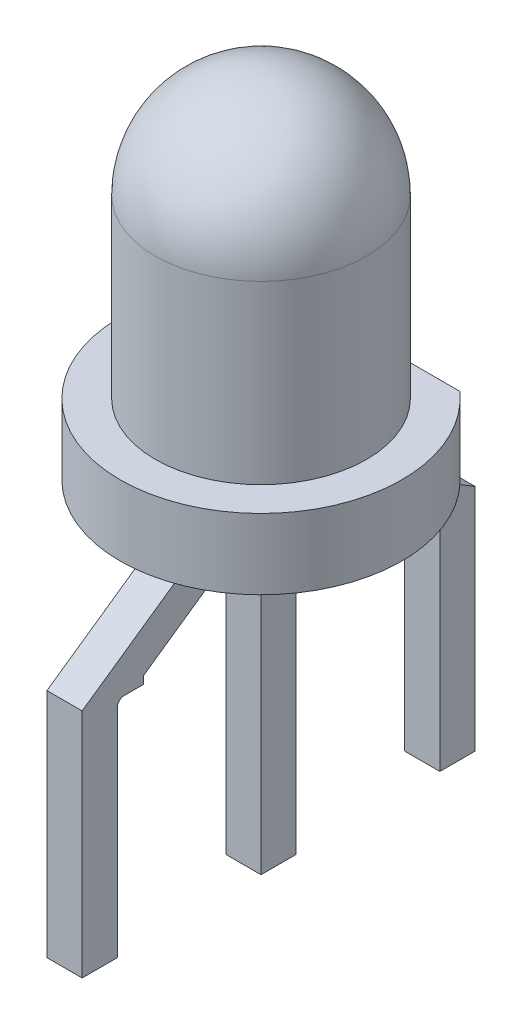
ISO-10303-21;
HEADER;
FILE_DESCRIPTION(('STEP AP214'),'2;1');
FILE_NAME('part.step','',(''),(''),'','','');
FILE_SCHEMA(('AUTOMOTIVE_DESIGN { 1 0 10303 214 1 1 1 1 }'));
ENDSEC;
DATA;
#1=APPLICATION_CONTEXT('core data for automotive mechanical design processes');
#2=APPLICATION_PROTOCOL_DEFINITION('international standard','automotive_design',2000,#1);
#3=PRODUCT_CONTEXT('',#1,'mechanical');
#4=PRODUCT('Part','Part','',(#3));
#5=PRODUCT_RELATED_PRODUCT_CATEGORY('part','',(#4));
#6=PRODUCT_DEFINITION_FORMATION('','',#4);
#7=PRODUCT_DEFINITION_CONTEXT('part definition',#1,'design');
#8=PRODUCT_DEFINITION('design','',#6,#7);
#9=PRODUCT_DEFINITION_SHAPE('','',#8);
#10=(LENGTH_UNIT() NAMED_UNIT(*) SI_UNIT(.MILLI.,.METRE.));
#11=(NAMED_UNIT(*) PLANE_ANGLE_UNIT() SI_UNIT($,.RADIAN.));
#12=(NAMED_UNIT(*) SI_UNIT($,.STERADIAN.) SOLID_ANGLE_UNIT());
#13=UNCERTAINTY_MEASURE_WITH_UNIT(LENGTH_MEASURE(1.E-05),#10,'distance_accuracy_value','');
#14=(GEOMETRIC_REPRESENTATION_CONTEXT(3) GLOBAL_UNCERTAINTY_ASSIGNED_CONTEXT((#13)) GLOBAL_UNIT_ASSIGNED_CONTEXT((#10,
#11,#12)) REPRESENTATION_CONTEXT('',''));
#15=CARTESIAN_POINT('',(0.,0.,0.));
#16=DIRECTION('',(0.,0.,1.));
#17=DIRECTION('',(1.,0.,0.));
#18=AXIS2_PLACEMENT_3D('',#15,#16,#17);
#19=CARTESIAN_POINT('',(-0.25,-33.1036291829165,-0.745030280763507));
#20=DIRECTION('',(-1.,0.,0.));
#21=DIRECTION('',(0.,0.,1.));
#22=AXIS2_PLACEMENT_3D('',#19,#20,#21);
#23=PLANE('',#22);
#24=DIRECTION('',(0.,0.,1.));
#25=VECTOR('',#24,1.);
#26=CARTESIAN_POINT('',(-0.25,0.,-0.745030280763507));
#27=LINE('',#26,#25);
#28=CARTESIAN_POINT('',(-0.25,0.,0.250000000000001));
#29=VERTEX_POINT('',#28);
#30=CARTESIAN_POINT('',(-0.25,0.,-0.250000000000001));
#31=VERTEX_POINT('',#30);
#32=EDGE_CURVE('E261',#29,#31,#27,.F.);
#33=ORIENTED_EDGE('',*,*,#32,.T.);
#34=DIRECTION('',(0.,-1.,0.));
#35=VECTOR('',#34,1.);
#36=CARTESIAN_POINT('',(-0.25,-33.1036291829165,-0.249999999999997));
#37=LINE('',#36,#35);
#38=CARTESIAN_POINT('',(-0.25,-4.60707603112542,-0.25));
#39=VERTEX_POINT('',#38);
#40=EDGE_CURVE('E402',#31,#39,#37,.T.);
#41=ORIENTED_EDGE('',*,*,#40,.T.);
#42=DIRECTION('',(0.,0.,1.));
#43=VECTOR('',#42,1.);
#44=CARTESIAN_POINT('',(-0.25,-4.60707603112542,3.26296421802397));
#45=LINE('',#44,#43);
#46=CARTESIAN_POINT('',(-0.25,-4.60707603112542,0.250000000000001));
#47=VERTEX_POINT('',#46);
#48=EDGE_CURVE('E397',#39,#47,#45,.T.);
#49=ORIENTED_EDGE('',*,*,#48,.T.);
#50=DIRECTION('',(0.,-1.,0.));
#51=VECTOR('',#50,1.);
#52=CARTESIAN_POINT('',(-0.25,-33.1036291829165,0.249999999999997));
#53=LINE('',#52,#51);
#54=EDGE_CURVE('E288',#29,#47,#53,.T.);
#55=ORIENTED_EDGE('',*,*,#54,.F.);
#56=EDGE_LOOP('',(#33,#41,#49,#55));
#57=FACE_BOUND('',#56,.T.);
#58=ADVANCED_FACE('F17',(#57),#23,.T.);
#59=CARTESIAN_POINT('',(-0.25,-33.1036291829165,-0.745030280763507));
#60=DIRECTION('',(-1.,0.,0.));
#61=DIRECTION('',(0.,0.,1.));
#62=AXIS2_PLACEMENT_3D('',#59,#60,#61);
#63=PLANE('',#62);
#64=CARTESIAN_POINT('',(-0.25,-1.53,2.1920011));
#65=DIRECTION('',(-1.,0.,0.));
#66=DIRECTION('',(0.,0.,1.));
#67=AXIS2_PLACEMENT_3D('',#64,#65,#66);
#68=CIRCLE('',#67,0.0979988999999992);
#69=CARTESIAN_POINT('',(-0.25,-1.4320011,2.1920011));
#70=VERTEX_POINT('',#69);
#71=CARTESIAN_POINT('',(-0.25,-1.53,2.29));
#72=VERTEX_POINT('',#71);
#73=EDGE_CURVE('E20',#70,#72,#68,.F.);
#74=ORIENTED_EDGE('',*,*,#73,.T.);
#75=DIRECTION('',(0.,1.,0.));
#76=VECTOR('',#75,1.);
#77=CARTESIAN_POINT('',(-0.25,-33.1036291829165,2.29));
#78=LINE('',#77,#76);
#79=CARTESIAN_POINT('',(-0.25,-4.60707603112542,2.29));
#80=VERTEX_POINT('',#79);
#81=EDGE_CURVE('E204',#80,#72,#78,.T.);
#82=ORIENTED_EDGE('',*,*,#81,.F.);
#83=DIRECTION('',(0.,0.,1.));
#84=VECTOR('',#83,1.);
#85=CARTESIAN_POINT('',(-0.25,-4.60707603112542,3.26296421802397));
#86=LINE('',#85,#84);
#87=CARTESIAN_POINT('',(-0.25,-4.60707603112542,2.79));
#88=VERTEX_POINT('',#87);
#89=EDGE_CURVE('E216',#80,#88,#86,.T.);
#90=ORIENTED_EDGE('',*,*,#89,.T.);
#91=DIRECTION('',(0.,-1.,0.));
#92=VECTOR('',#91,1.);
#93=CARTESIAN_POINT('',(-0.25,-33.1036291829165,2.78999999999999));
#94=LINE('',#93,#92);
#95=CARTESIAN_POINT('',(-0.25,-1.32219444197155,2.79));
#96=VERTEX_POINT('',#95);
#97=EDGE_CURVE('E238',#96,#88,#94,.T.);
#98=ORIENTED_EDGE('',*,*,#97,.F.);
#99=DIRECTION('',(0.,-0.572056991997396,0.820213873271412));
#100=VECTOR('',#99,1.);
#101=CARTESIAN_POINT('',(-0.25,-10.0639752924873,15.323943350043));
#102=LINE('',#101,#100);
#103=CARTESIAN_POINT('',(-0.25,-0.282996074506152,1.3));
#104=VERTEX_POINT('',#103);
#105=EDGE_CURVE('E286',#104,#96,#102,.T.);
#106=ORIENTED_EDGE('',*,*,#105,.F.);
#107=DIRECTION('',(0.,1.,0.));
#108=VECTOR('',#107,1.);
#109=CARTESIAN_POINT('',(-0.25,-33.1036291829165,1.3));
#110=LINE('',#109,#108);
#111=CARTESIAN_POINT('',(-0.25,0.,1.3));
#112=VERTEX_POINT('',#111);
#113=EDGE_CURVE('E264',#104,#112,#110,.T.);
#114=ORIENTED_EDGE('',*,*,#113,.T.);
#115=DIRECTION('',(0.,0.,1.));
#116=VECTOR('',#115,1.);
#117=CARTESIAN_POINT('',(-0.25,0.,-0.745030280763507));
#118=LINE('',#117,#116);
#119=CARTESIAN_POINT('',(-0.25,0.,0.799999999999999));
#120=VERTEX_POINT('',#119);
#121=EDGE_CURVE('E258',#112,#120,#118,.F.);
#122=ORIENTED_EDGE('',*,*,#121,.T.);
#123=DIRECTION('',(0.,1.,0.));
#124=VECTOR('',#123,1.);
#125=CARTESIAN_POINT('',(-0.25,-33.1036291829165,0.799999999999999));
#126=LINE('',#125,#124);
#127=CARTESIAN_POINT('',(-0.25,-0.543868891918857,0.799999999999998));
#128=VERTEX_POINT('',#127);
#129=EDGE_CURVE('E255',#120,#128,#126,.F.);
#130=ORIENTED_EDGE('',*,*,#129,.T.);
#131=DIRECTION('',(0.,0.572056991997396,-0.820213873271412));
#132=VECTOR('',#131,1.);
#133=CARTESIAN_POINT('',(-0.25,-10.474082229123,15.0379148540443));
#134=LINE('',#133,#132);
#135=CARTESIAN_POINT('',(-0.25,-1.32219444197155,1.91596121191667));
#136=VERTEX_POINT('',#135);
#137=EDGE_CURVE('E252',#136,#128,#134,.T.);
#138=ORIENTED_EDGE('',*,*,#137,.F.);
#139=DIRECTION('',(0.,1.,0.));
#140=VECTOR('',#139,1.);
#141=CARTESIAN_POINT('',(-0.25,-33.1036291829165,1.91596121191667));
#142=LINE('',#141,#140);
#143=CARTESIAN_POINT('',(-0.25,-1.4320011,1.91596121191667));
#144=VERTEX_POINT('',#143);
#145=EDGE_CURVE('E249',#144,#136,#142,.T.);
#146=ORIENTED_EDGE('',*,*,#145,.F.);
#147=DIRECTION('',(0.,0.,-1.));
#148=VECTOR('',#147,1.);
#149=CARTESIAN_POINT('',(-0.25,-1.4320011,-0.745030280763507));
#150=LINE('',#149,#148);
#151=EDGE_CURVE('E198',#70,#144,#150,.T.);
#152=ORIENTED_EDGE('',*,*,#151,.F.);
#153=EDGE_LOOP('',(#74,#82,#90,#98,#106,#114,#122,#130,#138,#146,#152));
#154=FACE_BOUND('',#153,.T.);
#155=ADVANCED_FACE('F202',(#154),#63,.T.);
#156=CARTESIAN_POINT('',(-0.25,-33.1036291829165,-0.745030280763507));
#157=DIRECTION('',(-1.,0.,0.));
#158=DIRECTION('',(0.,0.,1.));
#159=AXIS2_PLACEMENT_3D('',#156,#157,#158);
#160=PLANE('',#159);
#161=DIRECTION('',(0.,-0.518539477269152,-0.855053688673077));
#162=VECTOR('',#161,1.);
#163=CARTESIAN_POINT('',(-0.25,-8.98245643141332,-15.3730945478082));
#164=LINE('',#163,#162);
#165=CARTESIAN_POINT('',(-0.25,-0.447957151368763,-1.3));
#166=VERTEX_POINT('',#165);
#167=CARTESIAN_POINT('',(-0.25,-1.3515540030823,-2.79));
#168=VERTEX_POINT('',#167);
#169=EDGE_CURVE('E333',#166,#168,#164,.T.);
#170=ORIENTED_EDGE('',*,*,#169,.T.);
#171=DIRECTION('',(0.,-1.,0.));
#172=VECTOR('',#171,1.);
#173=CARTESIAN_POINT('',(-0.25,-33.1036291829165,-2.79));
#174=LINE('',#173,#172);
#175=CARTESIAN_POINT('',(-0.25,-4.60707603112542,-2.79));
#176=VERTEX_POINT('',#175);
#177=EDGE_CURVE('E422',#168,#176,#174,.T.);
#178=ORIENTED_EDGE('',*,*,#177,.T.);
#179=DIRECTION('',(0.,0.,1.));
#180=VECTOR('',#179,1.);
#181=CARTESIAN_POINT('',(-0.25,-4.60707603112542,3.26296421802397));
#182=LINE('',#181,#180);
#183=CARTESIAN_POINT('',(-0.25,-4.60707603112542,-2.29));
#184=VERTEX_POINT('',#183);
#185=EDGE_CURVE('E416',#176,#184,#182,.T.);
#186=ORIENTED_EDGE('',*,*,#185,.T.);
#187=DIRECTION('',(0.,1.,0.));
#188=VECTOR('',#187,1.);
#189=CARTESIAN_POINT('',(-0.25,-33.1036291829165,-2.29));
#190=LINE('',#189,#188);
#191=CARTESIAN_POINT('',(-0.25,-1.63,-2.29));
#192=VERTEX_POINT('',#191);
#193=EDGE_CURVE('E410',#184,#192,#190,.T.);
#194=ORIENTED_EDGE('',*,*,#193,.T.);
#195=CARTESIAN_POINT('',(-0.25,-1.63,-2.19));
#196=DIRECTION('',(-1.,0.,0.));
#197=DIRECTION('',(0.,0.,1.));
#198=AXIS2_PLACEMENT_3D('',#195,#196,#197);
#199=CIRCLE('',#198,0.0999999999999998);
#200=CARTESIAN_POINT('',(-0.25,-1.53,-2.19));
#201=VERTEX_POINT('',#200);
#202=EDGE_CURVE('E241',#192,#201,#199,.F.);
#203=ORIENTED_EDGE('',*,*,#202,.T.);
#204=DIRECTION('',(0.,0.,1.));
#205=VECTOR('',#204,1.);
#206=CARTESIAN_POINT('',(-0.25,-1.53,-0.745030280763514));
#207=LINE('',#206,#205);
#208=CARTESIAN_POINT('',(-0.25,-1.53,-1.2));
#209=VERTEX_POINT('',#208);
#210=EDGE_CURVE('E225',#201,#209,#207,.T.);
#211=ORIENTED_EDGE('',*,*,#210,.T.);
#212=CARTESIAN_POINT('',(-0.25,-1.13,-1.2));
#213=DIRECTION('',(-1.,0.,0.));
#214=DIRECTION('',(0.,0.,1.));
#215=AXIS2_PLACEMENT_3D('',#212,#213,#214);
#216=CIRCLE('',#215,0.4);
#217=CARTESIAN_POINT('',(-0.25,-1.13,-0.800000000000001));
#218=VERTEX_POINT('',#217);
#219=EDGE_CURVE('E319',#218,#209,#216,.F.);
#220=ORIENTED_EDGE('',*,*,#219,.F.);
#221=DIRECTION('',(0.,1.,0.));
#222=VECTOR('',#221,1.);
#223=CARTESIAN_POINT('',(-0.25,-33.1036291829165,-0.800000000000001));
#224=LINE('',#223,#222);
#225=CARTESIAN_POINT('',(-0.25,0.,-0.800000000000001));
#226=VERTEX_POINT('',#225);
#227=EDGE_CURVE('E257',#218,#226,#224,.T.);
#228=ORIENTED_EDGE('',*,*,#227,.T.);
#229=DIRECTION('',(0.,0.,1.));
#230=VECTOR('',#229,1.);
#231=CARTESIAN_POINT('',(-0.25,0.,-0.745030280763507));
#232=LINE('',#231,#230);
#233=CARTESIAN_POINT('',(-0.25,0.,-1.3));
#234=VERTEX_POINT('',#233);
#235=EDGE_CURVE('E265',#226,#234,#232,.F.);
#236=ORIENTED_EDGE('',*,*,#235,.T.);
#237=DIRECTION('',(0.,1.,0.));
#238=VECTOR('',#237,1.);
#239=CARTESIAN_POINT('',(-0.25,-33.1036291829165,-1.3));
#240=LINE('',#239,#238);
#241=EDGE_CURVE('E268',#234,#166,#240,.F.);
#242=ORIENTED_EDGE('',*,*,#241,.T.);
#243=EDGE_LOOP('',(#170,#178,#186,#194,#203,#211,#220,#228,#236,#242));
#244=FACE_BOUND('',#243,.T.);
#245=ADVANCED_FACE('F428',(#244),#160,.T.);
#246=CARTESIAN_POINT('',(0.25,-33.1036291829165,-0.249999999999997));
#247=DIRECTION('',(0.,0.,1.));
#248=DIRECTION('',(0.,-1.,0.));
#249=AXIS2_PLACEMENT_3D('',#246,#247,#248);
#250=PLANE('',#249);
#251=DIRECTION('',(1.,0.,0.));
#252=VECTOR('',#251,1.);
#253=CARTESIAN_POINT('',(-2.,-4.60707603112542,-0.249999999999999));
#254=LINE('',#253,#252);
#255=CARTESIAN_POINT('',(0.25,-4.60707603112542,-0.25));
#256=VERTEX_POINT('',#255);
#257=EDGE_CURVE('E399',#256,#39,#254,.F.);
#258=ORIENTED_EDGE('',*,*,#257,.T.);
#259=ORIENTED_EDGE('',*,*,#40,.F.);
#260=DIRECTION('',(1.,0.,0.));
#261=VECTOR('',#260,1.);
#262=CARTESIAN_POINT('',(0.25,0.,-0.250000000000001));
#263=LINE('',#262,#261);
#264=CARTESIAN_POINT('',(0.25,0.,-0.250000000000001));
#265=VERTEX_POINT('',#264);
#266=EDGE_CURVE('E404',#265,#31,#263,.F.);
#267=ORIENTED_EDGE('',*,*,#266,.F.);
#268=DIRECTION('',(0.,1.,0.));
#269=VECTOR('',#268,1.);
#270=CARTESIAN_POINT('',(0.25,-33.1036291829165,-0.250000000000001));
#271=LINE('',#270,#269);
#272=EDGE_CURVE('E412',#265,#256,#271,.F.);
#273=ORIENTED_EDGE('',*,*,#272,.T.);
#274=EDGE_LOOP('',(#258,#259,#267,#273));
#275=FACE_BOUND('',#274,.T.);
#276=ADVANCED_FACE('F603',(#275),#250,.F.);
#277=CARTESIAN_POINT('',(-2.,-4.60707603112542,3.26296421802397));
#278=DIRECTION('',(0.,1.,0.));
#279=DIRECTION('',(0.,0.,1.));
#280=AXIS2_PLACEMENT_3D('',#277,#278,#279);
#281=PLANE('',#280);
#282=DIRECTION('',(1.,0.,0.));
#283=VECTOR('',#282,1.);
#284=CARTESIAN_POINT('',(0.25,-4.60707603112542,0.250000000000001));
#285=LINE('',#284,#283);
#286=CARTESIAN_POINT('',(0.25,-4.60707603112542,0.250000000000001));
#287=VERTEX_POINT('',#286);
#288=EDGE_CURVE('E394',#47,#287,#285,.T.);
#289=ORIENTED_EDGE('',*,*,#288,.F.);
#290=ORIENTED_EDGE('',*,*,#48,.F.);
#291=ORIENTED_EDGE('',*,*,#257,.F.);
#292=DIRECTION('',(0.,0.,1.));
#293=VECTOR('',#292,1.);
#294=CARTESIAN_POINT('',(0.25,-4.60707603112542,-0.745030280763507));
#295=LINE('',#294,#293);
#296=EDGE_CURVE('E504',#256,#287,#295,.T.);
#297=ORIENTED_EDGE('',*,*,#296,.T.);
#298=EDGE_LOOP('',(#289,#290,#291,#297));
#299=FACE_BOUND('',#298,.T.);
#300=ADVANCED_FACE('F599',(#299),#281,.F.);
#301=CARTESIAN_POINT('',(0.25,-33.1036291829165,0.249999999999997));
#302=DIRECTION('',(0.,0.,1.));
#303=DIRECTION('',(0.,-1.,0.));
#304=AXIS2_PLACEMENT_3D('',#301,#302,#303);
#305=PLANE('',#304);
#306=DIRECTION('',(1.,0.,0.));
#307=VECTOR('',#306,1.);
#308=CARTESIAN_POINT('',(0.25,0.,0.250000000000001));
#309=LINE('',#308,#307);
#310=CARTESIAN_POINT('',(0.25,0.,0.250000000000001));
#311=VERTEX_POINT('',#310);
#312=EDGE_CURVE('E391',#311,#29,#309,.F.);
#313=ORIENTED_EDGE('',*,*,#312,.T.);
#314=ORIENTED_EDGE('',*,*,#54,.T.);
#315=ORIENTED_EDGE('',*,*,#288,.T.);
#316=DIRECTION('',(0.,1.,0.));
#317=VECTOR('',#316,1.);
#318=CARTESIAN_POINT('',(0.25,-33.1036291829165,0.250000000000001));
#319=LINE('',#318,#317);
#320=EDGE_CURVE('E501',#287,#311,#319,.T.);
#321=ORIENTED_EDGE('',*,*,#320,.T.);
#322=EDGE_LOOP('',(#313,#314,#315,#321));
#323=FACE_BOUND('',#322,.T.);
#324=ADVANCED_FACE('F595',(#323),#305,.T.);
#325=CARTESIAN_POINT('',(0.25,-10.0639752924873,15.323943350043));
#326=DIRECTION('',(0.,0.820213873271412,0.572056991997396));
#327=DIRECTION('',(0.,-0.572056991997396,0.820213873271412));
#328=AXIS2_PLACEMENT_3D('',#325,#326,#327);
#329=PLANE('',#328);
#330=DIRECTION('',(0.,0.572056991997396,-0.820213873271411));
#331=VECTOR('',#330,1.);
#332=CARTESIAN_POINT('',(0.25,-1.32219444197155,2.79));
#333=LINE('',#332,#331);
#334=CARTESIAN_POINT('',(0.25,-1.32219444197155,2.79));
#335=VERTEX_POINT('',#334);
#336=CARTESIAN_POINT('',(0.25,-0.282996074506154,1.3));
#337=VERTEX_POINT('',#336);
#338=EDGE_CURVE('E373',#335,#337,#333,.T.);
#339=ORIENTED_EDGE('',*,*,#338,.T.);
#340=DIRECTION('',(1.,0.,0.));
#341=VECTOR('',#340,1.);
#342=CARTESIAN_POINT('',(0.25,-0.282996074506152,1.3));
#343=LINE('',#342,#341);
#344=EDGE_CURVE('E291',#104,#337,#343,.T.);
#345=ORIENTED_EDGE('',*,*,#344,.F.);
#346=ORIENTED_EDGE('',*,*,#105,.T.);
#347=DIRECTION('',(1.,0.,0.));
#348=VECTOR('',#347,1.);
#349=CARTESIAN_POINT('',(0.25,-1.32219444197155,2.79));
#350=LINE('',#349,#348);
#351=EDGE_CURVE('E235',#335,#96,#350,.F.);
#352=ORIENTED_EDGE('',*,*,#351,.F.);
#353=EDGE_LOOP('',(#339,#345,#346,#352));
#354=FACE_BOUND('',#353,.T.);
#355=ADVANCED_FACE('F620',(#354),#329,.T.);
#356=CARTESIAN_POINT('',(0.25,-10.474082229123,15.0379148540443));
#357=DIRECTION('',(0.,-0.820213873271412,-0.572056991997396));
#358=DIRECTION('',(0.,0.572056991997396,-0.820213873271412));
#359=AXIS2_PLACEMENT_3D('',#356,#357,#358);
#360=PLANE('',#359);
#361=DIRECTION('',(0.,-0.572056991997398,0.82021387327141));
#362=VECTOR('',#361,1.);
#363=CARTESIAN_POINT('',(0.25,-0.543868891918854,0.799999999999997));
#364=LINE('',#363,#362);
#365=CARTESIAN_POINT('',(0.25,-0.543868891918858,0.8));
#366=VERTEX_POINT('',#365);
#367=CARTESIAN_POINT('',(0.25,-1.32219444197155,1.91596121191667));
#368=VERTEX_POINT('',#367);
#369=EDGE_CURVE('E355',#366,#368,#364,.T.);
#370=ORIENTED_EDGE('',*,*,#369,.T.);
#371=DIRECTION('',(-1.,0.,0.));
#372=VECTOR('',#371,1.);
#373=CARTESIAN_POINT('',(0.25,-1.32219444197155,1.91596121191667));
#374=LINE('',#373,#372);
#375=EDGE_CURVE('E246',#136,#368,#374,.F.);
#376=ORIENTED_EDGE('',*,*,#375,.F.);
#377=ORIENTED_EDGE('',*,*,#137,.T.);
#378=DIRECTION('',(1.,0.,0.));
#379=VECTOR('',#378,1.);
#380=CARTESIAN_POINT('',(0.25,-0.543868891918854,0.799999999999999));
#381=LINE('',#380,#379);
#382=EDGE_CURVE('E294',#366,#128,#381,.F.);
#383=ORIENTED_EDGE('',*,*,#382,.F.);
#384=EDGE_LOOP('',(#370,#376,#377,#383));
#385=FACE_BOUND('',#384,.T.);
#386=ADVANCED_FACE('F623',(#385),#360,.T.);
#387=CARTESIAN_POINT('',(0.25,-33.1036291829165,1.91596121191667));
#388=DIRECTION('',(0.,0.,-1.));
#389=DIRECTION('',(-1.,0.,0.));
#390=AXIS2_PLACEMENT_3D('',#387,#388,#389);
#391=PLANE('',#390);
#392=DIRECTION('',(0.,1.,0.));
#393=VECTOR('',#392,1.);
#394=CARTESIAN_POINT('',(0.25,-33.1036291829165,1.91596121191667));
#395=LINE('',#394,#393);
#396=CARTESIAN_POINT('',(0.25,-1.4320011,1.91596121191667));
#397=VERTEX_POINT('',#396);
#398=EDGE_CURVE('E353',#368,#397,#395,.F.);
#399=ORIENTED_EDGE('',*,*,#398,.T.);
#400=DIRECTION('',(1.,0.,0.));
#401=VECTOR('',#400,1.);
#402=CARTESIAN_POINT('',(0.25,-1.4320011,1.91596121191667));
#403=LINE('',#402,#401);
#404=EDGE_CURVE('E245',#144,#397,#403,.T.);
#405=ORIENTED_EDGE('',*,*,#404,.F.);
#406=ORIENTED_EDGE('',*,*,#145,.T.);
#407=ORIENTED_EDGE('',*,*,#375,.T.);
#408=EDGE_LOOP('',(#399,#405,#406,#407));
#409=FACE_BOUND('',#408,.T.);
#410=ADVANCED_FACE('F627',(#409),#391,.T.);
#411=CARTESIAN_POINT('',(0.25,-1.4320011,-0.745030280763507));
#412=DIRECTION('',(0.,-1.,0.));
#413=DIRECTION('',(0.,0.,-1.));
#414=AXIS2_PLACEMENT_3D('',#411,#412,#413);
#415=PLANE('',#414);
#416=DIRECTION('',(0.,0.,1.));
#417=VECTOR('',#416,1.);
#418=CARTESIAN_POINT('',(0.25,-1.4320011,-0.745030280763507));
#419=LINE('',#418,#417);
#420=CARTESIAN_POINT('',(0.25,-1.4320011,2.1920011));
#421=VERTEX_POINT('',#420);
#422=EDGE_CURVE('E314',#397,#421,#419,.T.);
#423=ORIENTED_EDGE('',*,*,#422,.T.);
#424=DIRECTION('',(-1.,0.,0.));
#425=VECTOR('',#424,1.);
#426=CARTESIAN_POINT('',(0.25,-1.4320011,2.1920011));
#427=LINE('',#426,#425);
#428=EDGE_CURVE('E208',#421,#70,#427,.T.);
#429=ORIENTED_EDGE('',*,*,#428,.T.);
#430=ORIENTED_EDGE('',*,*,#151,.T.);
#431=ORIENTED_EDGE('',*,*,#404,.T.);
#432=EDGE_LOOP('',(#423,#429,#430,#431));
#433=FACE_BOUND('',#432,.T.);
#434=ADVANCED_FACE('F631',(#433),#415,.T.);
#435=CARTESIAN_POINT('',(0.25,-1.53,2.1920011));
#436=DIRECTION('',(-1.,0.,0.));
#437=DIRECTION('',(0.,0.,1.));
#438=AXIS2_PLACEMENT_3D('',#435,#436,#437);
#439=CYLINDRICAL_SURFACE('',#438,0.0979988999999992);
#440=ORIENTED_EDGE('',*,*,#428,.F.);
#441=CARTESIAN_POINT('',(0.25,-1.53,2.1920011));
#442=DIRECTION('',(-1.,0.,0.));
#443=DIRECTION('',(0.,0.,1.));
#444=AXIS2_PLACEMENT_3D('',#441,#442,#443);
#445=CIRCLE('',#444,0.0979988999999992);
#446=CARTESIAN_POINT('',(0.25,-1.53,2.29));
#447=VERTEX_POINT('',#446);
#448=EDGE_CURVE('E213',#421,#447,#445,.F.);
#449=ORIENTED_EDGE('',*,*,#448,.T.);
#450=DIRECTION('',(1.,0.,0.));
#451=VECTOR('',#450,1.);
#452=CARTESIAN_POINT('',(0.25,-1.53,2.29));
#453=LINE('',#452,#451);
#454=EDGE_CURVE('E210',#72,#447,#453,.T.);
#455=ORIENTED_EDGE('',*,*,#454,.F.);
#456=ORIENTED_EDGE('',*,*,#73,.F.);
#457=EDGE_LOOP('',(#440,#449,#455,#456));
#458=FACE_BOUND('',#457,.T.);
#459=ADVANCED_FACE('F211',(#458),#439,.F.);
#460=CARTESIAN_POINT('',(0.25,-33.1036291829165,2.29));
#461=DIRECTION('',(0.,0.,-1.));
#462=DIRECTION('',(0.,1.,0.));
#463=AXIS2_PLACEMENT_3D('',#460,#461,#462);
#464=PLANE('',#463);
#465=ORIENTED_EDGE('',*,*,#454,.T.);
#466=DIRECTION('',(0.,1.,0.));
#467=VECTOR('',#466,1.);
#468=CARTESIAN_POINT('',(0.25,-33.1036291829165,2.29));
#469=LINE('',#468,#467);
#470=CARTESIAN_POINT('',(0.25,-4.60707603112542,2.29));
#471=VERTEX_POINT('',#470);
#472=EDGE_CURVE('E313',#447,#471,#469,.F.);
#473=ORIENTED_EDGE('',*,*,#472,.T.);
#474=DIRECTION('',(1.,0.,0.));
#475=VECTOR('',#474,1.);
#476=CARTESIAN_POINT('',(-2.,-4.60707603112542,2.29));
#477=LINE('',#476,#475);
#478=EDGE_CURVE('E220',#471,#80,#477,.F.);
#479=ORIENTED_EDGE('',*,*,#478,.T.);
#480=ORIENTED_EDGE('',*,*,#81,.T.);
#481=EDGE_LOOP('',(#465,#473,#479,#480));
#482=FACE_BOUND('',#481,.T.);
#483=ADVANCED_FACE('F218',(#482),#464,.T.);
#484=CARTESIAN_POINT('',(-2.,-4.60707603112542,3.26296421802397));
#485=DIRECTION('',(0.,1.,0.));
#486=DIRECTION('',(0.,0.,1.));
#487=AXIS2_PLACEMENT_3D('',#484,#485,#486);
#488=PLANE('',#487);
#489=DIRECTION('',(0.,0.,1.));
#490=VECTOR('',#489,1.);
#491=CARTESIAN_POINT('',(0.25,-4.60707603112542,-0.745030280763507));
#492=LINE('',#491,#490);
#493=CARTESIAN_POINT('',(0.25,-4.60707603112542,2.79));
#494=VERTEX_POINT('',#493);
#495=EDGE_CURVE('E343',#471,#494,#492,.T.);
#496=ORIENTED_EDGE('',*,*,#495,.T.);
#497=DIRECTION('',(1.,0.,0.));
#498=VECTOR('',#497,1.);
#499=CARTESIAN_POINT('',(0.25,-4.60707603112542,2.79));
#500=LINE('',#499,#498);
#501=EDGE_CURVE('E232',#88,#494,#500,.T.);
#502=ORIENTED_EDGE('',*,*,#501,.F.);
#503=ORIENTED_EDGE('',*,*,#89,.F.);
#504=ORIENTED_EDGE('',*,*,#478,.F.);
#505=EDGE_LOOP('',(#496,#502,#503,#504));
#506=FACE_BOUND('',#505,.T.);
#507=ADVANCED_FACE('F640',(#506),#488,.F.);
#508=CARTESIAN_POINT('',(0.25,-33.1036291829165,2.78999999999999));
#509=DIRECTION('',(0.,0.,1.));
#510=DIRECTION('',(0.,-1.,0.));
#511=AXIS2_PLACEMENT_3D('',#508,#509,#510);
#512=PLANE('',#511);
#513=ORIENTED_EDGE('',*,*,#351,.T.);
#514=ORIENTED_EDGE('',*,*,#97,.T.);
#515=ORIENTED_EDGE('',*,*,#501,.T.);
#516=DIRECTION('',(0.,1.,0.));
#517=VECTOR('',#516,1.);
#518=CARTESIAN_POINT('',(0.25,-33.1036291829165,2.79));
#519=LINE('',#518,#517);
#520=EDGE_CURVE('E345',#494,#335,#519,.T.);
#521=ORIENTED_EDGE('',*,*,#520,.T.);
#522=EDGE_LOOP('',(#513,#514,#515,#521));
#523=FACE_BOUND('',#522,.T.);
#524=ADVANCED_FACE('F556',(#523),#512,.T.);
#525=CARTESIAN_POINT('',(0.25,-1.63,-2.19));
#526=DIRECTION('',(-1.,0.,0.));
#527=DIRECTION('',(0.,0.,1.));
#528=AXIS2_PLACEMENT_3D('',#525,#526,#527);
#529=CYLINDRICAL_SURFACE('',#528,0.0999999999999998);
#530=DIRECTION('',(1.,0.,0.));
#531=VECTOR('',#530,1.);
#532=CARTESIAN_POINT('',(0.25,-1.63,-2.29));
#533=LINE('',#532,#531);
#534=CARTESIAN_POINT('',(0.25,-1.63,-2.29));
#535=VERTEX_POINT('',#534);
#536=EDGE_CURVE('E418',#192,#535,#533,.T.);
#537=ORIENTED_EDGE('',*,*,#536,.T.);
#538=CARTESIAN_POINT('',(0.25,-1.63,-2.19));
#539=DIRECTION('',(-1.,0.,0.));
#540=DIRECTION('',(0.,0.,1.));
#541=AXIS2_PLACEMENT_3D('',#538,#539,#540);
#542=CIRCLE('',#541,0.0999999999999998);
#543=CARTESIAN_POINT('',(0.25,-1.53,-2.19));
#544=VERTEX_POINT('',#543);
#545=EDGE_CURVE('E309',#535,#544,#542,.F.);
#546=ORIENTED_EDGE('',*,*,#545,.T.);
#547=DIRECTION('',(1.,0.,0.));
#548=VECTOR('',#547,1.);
#549=CARTESIAN_POINT('',(0.25,-1.53,-2.19));
#550=LINE('',#549,#548);
#551=EDGE_CURVE('E322',#544,#201,#550,.F.);
#552=ORIENTED_EDGE('',*,*,#551,.T.);
#553=ORIENTED_EDGE('',*,*,#202,.F.);
#554=EDGE_LOOP('',(#537,#546,#552,#553));
#555=FACE_BOUND('',#554,.T.);
#556=ADVANCED_FACE('F545',(#555),#529,.F.);
#557=CARTESIAN_POINT('',(0.25,-1.53,-0.745030280763514));
#558=DIRECTION('',(0.,1.,0.));
#559=DIRECTION('',(0.,0.,1.));
#560=AXIS2_PLACEMENT_3D('',#557,#558,#559);
#561=PLANE('',#560);
#562=ORIENTED_EDGE('',*,*,#551,.F.);
#563=DIRECTION('',(0.,0.,1.));
#564=VECTOR('',#563,1.);
#565=CARTESIAN_POINT('',(0.25,-1.53,-0.745030280763507));
#566=LINE('',#565,#564);
#567=CARTESIAN_POINT('',(0.25,-1.53,-1.2));
#568=VERTEX_POINT('',#567);
#569=EDGE_CURVE('E308',#544,#568,#566,.T.);
#570=ORIENTED_EDGE('',*,*,#569,.T.);
#571=DIRECTION('',(-1.,0.,0.));
#572=VECTOR('',#571,1.);
#573=CARTESIAN_POINT('',(0.25,-1.53,-1.2));
#574=LINE('',#573,#572);
#575=EDGE_CURVE('E321',#209,#568,#574,.F.);
#576=ORIENTED_EDGE('',*,*,#575,.F.);
#577=ORIENTED_EDGE('',*,*,#210,.F.);
#578=EDGE_LOOP('',(#562,#570,#576,#577));
#579=FACE_BOUND('',#578,.T.);
#580=ADVANCED_FACE('F547',(#579),#561,.F.);
#581=CARTESIAN_POINT('',(0.25,-1.13,-1.2));
#582=DIRECTION('',(-1.,0.,0.));
#583=DIRECTION('',(0.,0.,1.));
#584=AXIS2_PLACEMENT_3D('',#581,#582,#583);
#585=CYLINDRICAL_SURFACE('',#584,0.4);
#586=CARTESIAN_POINT('',(0.25,-1.13,-1.2));
#587=DIRECTION('',(-1.,0.,0.));
#588=DIRECTION('',(0.,0.,1.));
#589=AXIS2_PLACEMENT_3D('',#586,#587,#588);
#590=CIRCLE('',#589,0.4);
#591=CARTESIAN_POINT('',(0.25,-1.13,-0.800000000000001));
#592=VERTEX_POINT('',#591);
#593=EDGE_CURVE('E305',#568,#592,#590,.T.);
#594=ORIENTED_EDGE('',*,*,#593,.T.);
#595=DIRECTION('',(1.,0.,0.));
#596=VECTOR('',#595,1.);
#597=CARTESIAN_POINT('',(0.25,-1.13,-0.800000000000001));
#598=LINE('',#597,#596);
#599=EDGE_CURVE('E442',#592,#218,#598,.F.);
#600=ORIENTED_EDGE('',*,*,#599,.T.);
#601=ORIENTED_EDGE('',*,*,#219,.T.);
#602=ORIENTED_EDGE('',*,*,#575,.T.);
#603=EDGE_LOOP('',(#594,#600,#601,#602));
#604=FACE_BOUND('',#603,.T.);
#605=ADVANCED_FACE('F473',(#604),#585,.T.);
#606=CARTESIAN_POINT('',(0.25,-8.98245643141332,-15.3730945478082));
#607=DIRECTION('',(0.,-0.855053688673077,0.518539477269152));
#608=DIRECTION('',(0.,-0.518539477269152,-0.855053688673077));
#609=AXIS2_PLACEMENT_3D('',#606,#607,#608);
#610=PLANE('',#609);
#611=DIRECTION('',(1.,0.,0.));
#612=VECTOR('',#611,1.);
#613=CARTESIAN_POINT('',(0.25,-0.447957151368764,-1.3));
#614=LINE('',#613,#612);
#615=CARTESIAN_POINT('',(0.25,-0.447957151368764,-1.3));
#616=VERTEX_POINT('',#615);
#617=EDGE_CURVE('E311',#166,#616,#614,.T.);
#618=ORIENTED_EDGE('',*,*,#617,.T.);
#619=DIRECTION('',(0.,-0.518539477269152,-0.855053688673077));
#620=VECTOR('',#619,1.);
#621=CARTESIAN_POINT('',(0.25,-0.447957151368764,-1.3));
#622=LINE('',#621,#620);
#623=CARTESIAN_POINT('',(0.25,-1.3515540030823,-2.79));
#624=VERTEX_POINT('',#623);
#625=EDGE_CURVE('E480',#616,#624,#622,.T.);
#626=ORIENTED_EDGE('',*,*,#625,.T.);
#627=DIRECTION('',(1.,0.,0.));
#628=VECTOR('',#627,1.);
#629=CARTESIAN_POINT('',(0.25,-1.3515540030823,-2.79));
#630=LINE('',#629,#628);
#631=EDGE_CURVE('E335',#624,#168,#630,.F.);
#632=ORIENTED_EDGE('',*,*,#631,.T.);
#633=ORIENTED_EDGE('',*,*,#169,.F.);
#634=EDGE_LOOP('',(#618,#626,#632,#633));
#635=FACE_BOUND('',#634,.T.);
#636=ADVANCED_FACE('F434',(#635),#610,.F.);
#637=CARTESIAN_POINT('',(0.25,-33.1036291829165,-2.79));
#638=DIRECTION('',(0.,0.,1.));
#639=DIRECTION('',(0.,-1.,0.));
#640=AXIS2_PLACEMENT_3D('',#637,#638,#639);
#641=PLANE('',#640);
#642=DIRECTION('',(1.,0.,0.));
#643=VECTOR('',#642,1.);
#644=CARTESIAN_POINT('',(-2.,-4.60707603112542,-2.79));
#645=LINE('',#644,#643);
#646=CARTESIAN_POINT('',(0.25,-4.60707603112542,-2.79));
#647=VERTEX_POINT('',#646);
#648=EDGE_CURVE('E419',#647,#176,#645,.F.);
#649=ORIENTED_EDGE('',*,*,#648,.T.);
#650=ORIENTED_EDGE('',*,*,#177,.F.);
#651=ORIENTED_EDGE('',*,*,#631,.F.);
#652=DIRECTION('',(0.,1.,0.));
#653=VECTOR('',#652,1.);
#654=CARTESIAN_POINT('',(0.25,-33.1036291829165,-2.79));
#655=LINE('',#654,#653);
#656=EDGE_CURVE('E515',#624,#647,#655,.F.);
#657=ORIENTED_EDGE('',*,*,#656,.T.);
#658=EDGE_LOOP('',(#649,#650,#651,#657));
#659=FACE_BOUND('',#658,.T.);
#660=ADVANCED_FACE('F532',(#659),#641,.F.);
#661=CARTESIAN_POINT('',(-2.,-4.60707603112542,3.26296421802397));
#662=DIRECTION('',(0.,1.,0.));
#663=DIRECTION('',(0.,0.,1.));
#664=AXIS2_PLACEMENT_3D('',#661,#662,#663);
#665=PLANE('',#664);
#666=ORIENTED_EDGE('',*,*,#648,.F.);
#667=DIRECTION('',(0.,0.,1.));
#668=VECTOR('',#667,1.);
#669=CARTESIAN_POINT('',(0.25,-4.60707603112542,-0.745030280763507));
#670=LINE('',#669,#668);
#671=CARTESIAN_POINT('',(0.25,-4.60707603112542,-2.29));
#672=VERTEX_POINT('',#671);
#673=EDGE_CURVE('E512',#647,#672,#670,.T.);
#674=ORIENTED_EDGE('',*,*,#673,.T.);
#675=DIRECTION('',(1.,0.,0.));
#676=VECTOR('',#675,1.);
#677=CARTESIAN_POINT('',(0.25,-4.60707603112542,-2.29));
#678=LINE('',#677,#676);
#679=EDGE_CURVE('E413',#672,#184,#678,.F.);
#680=ORIENTED_EDGE('',*,*,#679,.T.);
#681=ORIENTED_EDGE('',*,*,#185,.F.);
#682=EDGE_LOOP('',(#666,#674,#680,#681));
#683=FACE_BOUND('',#682,.T.);
#684=ADVANCED_FACE('F539',(#683),#665,.F.);
#685=CARTESIAN_POINT('',(0.25,-33.1036291829165,-2.29));
#686=DIRECTION('',(0.,0.,-1.));
#687=DIRECTION('',(0.,1.,0.));
#688=AXIS2_PLACEMENT_3D('',#685,#686,#687);
#689=PLANE('',#688);
#690=ORIENTED_EDGE('',*,*,#679,.F.);
#691=DIRECTION('',(0.,1.,0.));
#692=VECTOR('',#691,1.);
#693=CARTESIAN_POINT('',(0.25,-33.1036291829165,-2.29));
#694=LINE('',#693,#692);
#695=EDGE_CURVE('E514',#672,#535,#694,.T.);
#696=ORIENTED_EDGE('',*,*,#695,.T.);
#697=ORIENTED_EDGE('',*,*,#536,.F.);
#698=ORIENTED_EDGE('',*,*,#193,.F.);
#699=EDGE_LOOP('',(#690,#696,#697,#698));
#700=FACE_BOUND('',#699,.T.);
#701=ADVANCED_FACE('F543',(#700),#689,.F.);
#702=CARTESIAN_POINT('',(0.25,-33.1036291829165,-0.745030280763507));
#703=DIRECTION('',(-1.,0.,0.));
#704=DIRECTION('',(0.,0.,1.));
#705=AXIS2_PLACEMENT_3D('',#702,#703,#704);
#706=PLANE('',#705);
#707=ORIENTED_EDGE('',*,*,#296,.F.);
#708=ORIENTED_EDGE('',*,*,#272,.F.);
#709=DIRECTION('',(0.,0.,1.));
#710=VECTOR('',#709,1.);
#711=CARTESIAN_POINT('',(0.25,0.,0.));
#712=LINE('',#711,#710);
#713=EDGE_CURVE('E583',#265,#311,#712,.T.);
#714=ORIENTED_EDGE('',*,*,#713,.T.);
#715=ORIENTED_EDGE('',*,*,#320,.F.);
#716=EDGE_LOOP('',(#707,#708,#714,#715));
#717=FACE_BOUND('',#716,.T.);
#718=ADVANCED_FACE('F590',(#717),#706,.F.);
#719=CARTESIAN_POINT('',(-4.54142135623731,1.,-1.5));
#720=DIRECTION('',(0.,0.,-1.));
#721=DIRECTION('',(-1.,0.,0.));
#722=AXIS2_PLACEMENT_3D('',#719,#720,#721);
#723=PLANE('',#722);
#724=DIRECTION('',(-1.,0.,0.));
#725=VECTOR('',#724,1.);
#726=CARTESIAN_POINT('',(-4.54142135623731,1.,-1.5));
#727=LINE('',#726,#725);
#728=CARTESIAN_POINT('',(-1.32287565553229,1.,-1.5));
#729=VERTEX_POINT('',#728);
#730=CARTESIAN_POINT('',(1.3228756555323,1.,-1.5));
#731=VERTEX_POINT('',#730);
#732=EDGE_CURVE('E315',#729,#731,#727,.F.);
#733=ORIENTED_EDGE('',*,*,#732,.T.);
#734=DIRECTION('',(0.,1.,0.));
#735=VECTOR('',#734,1.);
#736=CARTESIAN_POINT('',(1.3228756555323,1.,-1.5));
#737=LINE('',#736,#735);
#738=CARTESIAN_POINT('',(1.3228756555323,0.,-1.5));
#739=VERTEX_POINT('',#738);
#740=EDGE_CURVE('E295',#731,#739,#737,.F.);
#741=ORIENTED_EDGE('',*,*,#740,.T.);
#742=DIRECTION('',(1.,0.,0.));
#743=VECTOR('',#742,1.);
#744=CARTESIAN_POINT('',(-4.54142135623731,0.,-1.5));
#745=LINE('',#744,#743);
#746=CARTESIAN_POINT('',(-1.32287565553229,0.,-1.5));
#747=VERTEX_POINT('',#746);
#748=EDGE_CURVE('E279',#739,#747,#745,.F.);
#749=ORIENTED_EDGE('',*,*,#748,.T.);
#750=DIRECTION('',(0.,1.,0.));
#751=VECTOR('',#750,1.);
#752=CARTESIAN_POINT('',(-1.32287565553229,1.,-1.5));
#753=LINE('',#752,#751);
#754=EDGE_CURVE('E318',#747,#729,#753,.T.);
#755=ORIENTED_EDGE('',*,*,#754,.T.);
#756=EDGE_LOOP('',(#733,#741,#749,#755));
#757=FACE_BOUND('',#756,.T.);
#758=ADVANCED_FACE('F680',(#757),#723,.T.);
#759=CARTESIAN_POINT('',(0.25,-33.1036291829165,1.3));
#760=DIRECTION('',(0.,0.,1.));
#761=DIRECTION('',(1.,0.,0.));
#762=AXIS2_PLACEMENT_3D('',#759,#760,#761);
#763=PLANE('',#762);
#764=DIRECTION('',(0.,1.,0.));
#765=VECTOR('',#764,1.);
#766=CARTESIAN_POINT('',(0.25,-33.1036291829165,1.3));
#767=LINE('',#766,#765);
#768=CARTESIAN_POINT('',(0.25,0.,1.3));
#769=VERTEX_POINT('',#768);
#770=EDGE_CURVE('E368',#337,#769,#767,.T.);
#771=ORIENTED_EDGE('',*,*,#770,.T.);
#772=DIRECTION('',(1.,0.,0.));
#773=VECTOR('',#772,1.);
#774=CARTESIAN_POINT('',(-4.54142135623731,0.,1.3));
#775=LINE('',#774,#773);
#776=EDGE_CURVE('E275',#769,#112,#775,.F.);
#777=ORIENTED_EDGE('',*,*,#776,.T.);
#778=ORIENTED_EDGE('',*,*,#113,.F.);
#779=ORIENTED_EDGE('',*,*,#344,.T.);
#780=EDGE_LOOP('',(#771,#777,#778,#779));
#781=FACE_BOUND('',#780,.T.);
#782=ADVANCED_FACE('F662',(#781),#763,.T.);
#783=CARTESIAN_POINT('',(0.25,-33.1036291829165,0.799999999999986));
#784=DIRECTION('',(0.,0.,-1.));
#785=DIRECTION('',(0.,1.,0.));
#786=AXIS2_PLACEMENT_3D('',#783,#784,#785);
#787=PLANE('',#786);
#788=DIRECTION('',(0.,1.,0.));
#789=VECTOR('',#788,1.);
#790=CARTESIAN_POINT('',(0.25,-33.1036291829165,0.799999999999999));
#791=LINE('',#790,#789);
#792=CARTESIAN_POINT('',(0.25,0.,0.799999999999999));
#793=VERTEX_POINT('',#792);
#794=EDGE_CURVE('E363',#793,#366,#791,.F.);
#795=ORIENTED_EDGE('',*,*,#794,.T.);
#796=ORIENTED_EDGE('',*,*,#382,.T.);
#797=ORIENTED_EDGE('',*,*,#129,.F.);
#798=DIRECTION('',(1.,0.,0.));
#799=VECTOR('',#798,1.);
#800=CARTESIAN_POINT('',(-4.54142135623731,0.,0.799999999999999));
#801=LINE('',#800,#799);
#802=EDGE_CURVE('E278',#120,#793,#801,.T.);
#803=ORIENTED_EDGE('',*,*,#802,.T.);
#804=EDGE_LOOP('',(#795,#796,#797,#803));
#805=FACE_BOUND('',#804,.T.);
#806=ADVANCED_FACE('F667',(#805),#787,.T.);
#807=CARTESIAN_POINT('',(0.25,-33.1036291829165,-0.745030280763507));
#808=DIRECTION('',(-1.,0.,0.));
#809=DIRECTION('',(0.,0.,1.));
#810=AXIS2_PLACEMENT_3D('',#807,#808,#809);
#811=PLANE('',#810);
#812=ORIENTED_EDGE('',*,*,#495,.F.);
#813=ORIENTED_EDGE('',*,*,#472,.F.);
#814=ORIENTED_EDGE('',*,*,#448,.F.);
#815=ORIENTED_EDGE('',*,*,#422,.F.);
#816=ORIENTED_EDGE('',*,*,#398,.F.);
#817=ORIENTED_EDGE('',*,*,#369,.F.);
#818=ORIENTED_EDGE('',*,*,#794,.F.);
#819=DIRECTION('',(0.,0.,1.));
#820=VECTOR('',#819,1.);
#821=CARTESIAN_POINT('',(0.25,0.,0.));
#822=LINE('',#821,#820);
#823=EDGE_CURVE('E377',#793,#769,#822,.T.);
#824=ORIENTED_EDGE('',*,*,#823,.T.);
#825=ORIENTED_EDGE('',*,*,#770,.F.);
#826=ORIENTED_EDGE('',*,*,#338,.F.);
#827=ORIENTED_EDGE('',*,*,#520,.F.);
#828=EDGE_LOOP('',(#812,#813,#814,#815,#816,#817,#818,#824,#825,#826,#827));
#829=FACE_BOUND('',#828,.T.);
#830=ADVANCED_FACE('F656',(#829),#811,.F.);
#831=CARTESIAN_POINT('',(0.25,-33.1036291829165,-0.80000000000002));
#832=DIRECTION('',(0.,0.,-1.));
#833=DIRECTION('',(0.,1.,0.));
#834=AXIS2_PLACEMENT_3D('',#831,#832,#833);
#835=PLANE('',#834);
#836=ORIENTED_EDGE('',*,*,#599,.F.);
#837=DIRECTION('',(0.,1.,0.));
#838=VECTOR('',#837,1.);
#839=CARTESIAN_POINT('',(0.25,-33.1036291829165,-0.800000000000001));
#840=LINE('',#839,#838);
#841=CARTESIAN_POINT('',(0.25,0.,-0.800000000000001));
#842=VERTEX_POINT('',#841);
#843=EDGE_CURVE('E307',#592,#842,#840,.T.);
#844=ORIENTED_EDGE('',*,*,#843,.T.);
#845=DIRECTION('',(1.,0.,0.));
#846=VECTOR('',#845,1.);
#847=CARTESIAN_POINT('',(-4.54142135623731,0.,-0.8));
#848=LINE('',#847,#846);
#849=EDGE_CURVE('E382',#842,#226,#848,.F.);
#850=ORIENTED_EDGE('',*,*,#849,.T.);
#851=ORIENTED_EDGE('',*,*,#227,.F.);
#852=EDGE_LOOP('',(#836,#844,#850,#851));
#853=FACE_BOUND('',#852,.T.);
#854=ADVANCED_FACE('F465',(#853),#835,.F.);
#855=CARTESIAN_POINT('',(0.25,-33.1036291829165,-1.3));
#856=DIRECTION('',(0.,0.,1.));
#857=DIRECTION('',(1.,0.,0.));
#858=AXIS2_PLACEMENT_3D('',#855,#856,#857);
#859=PLANE('',#858);
#860=DIRECTION('',(1.,0.,0.));
#861=VECTOR('',#860,1.);
#862=CARTESIAN_POINT('',(-4.54142135623731,0.,-1.3));
#863=LINE('',#862,#861);
#864=CARTESIAN_POINT('',(0.25,0.,-1.3));
#865=VERTEX_POINT('',#864);
#866=EDGE_CURVE('E452',#234,#865,#863,.T.);
#867=ORIENTED_EDGE('',*,*,#866,.T.);
#868=DIRECTION('',(0.,1.,0.));
#869=VECTOR('',#868,1.);
#870=CARTESIAN_POINT('',(0.25,-33.1036291829165,-1.3));
#871=LINE('',#870,#869);
#872=EDGE_CURVE('E440',#865,#616,#871,.F.);
#873=ORIENTED_EDGE('',*,*,#872,.T.);
#874=ORIENTED_EDGE('',*,*,#617,.F.);
#875=ORIENTED_EDGE('',*,*,#241,.F.);
#876=EDGE_LOOP('',(#867,#873,#874,#875));
#877=FACE_BOUND('',#876,.T.);
#878=ADVANCED_FACE('F438',(#877),#859,.F.);
#879=CARTESIAN_POINT('',(0.25,-33.1036291829165,-0.745030280763507));
#880=DIRECTION('',(-1.,0.,0.));
#881=DIRECTION('',(0.,0.,1.));
#882=AXIS2_PLACEMENT_3D('',#879,#880,#881);
#883=PLANE('',#882);
#884=ORIENTED_EDGE('',*,*,#673,.F.);
#885=ORIENTED_EDGE('',*,*,#656,.F.);
#886=ORIENTED_EDGE('',*,*,#625,.F.);
#887=ORIENTED_EDGE('',*,*,#872,.F.);
#888=DIRECTION('',(0.,0.,1.));
#889=VECTOR('',#888,1.);
#890=CARTESIAN_POINT('',(0.25,0.,0.));
#891=LINE('',#890,#889);
#892=EDGE_CURVE('E304',#865,#842,#891,.T.);
#893=ORIENTED_EDGE('',*,*,#892,.T.);
#894=ORIENTED_EDGE('',*,*,#843,.F.);
#895=ORIENTED_EDGE('',*,*,#593,.F.);
#896=ORIENTED_EDGE('',*,*,#569,.F.);
#897=ORIENTED_EDGE('',*,*,#545,.F.);
#898=ORIENTED_EDGE('',*,*,#695,.F.);
#899=EDGE_LOOP('',(#884,#885,#886,#887,#893,#894,#895,#896,#897,#898));
#900=FACE_BOUND('',#899,.T.);
#901=ADVANCED_FACE('F477',(#900),#883,.F.);
#902=CARTESIAN_POINT('',(-4.54142135623731,0.,0.));
#903=DIRECTION('',(0.,1.,0.));
#904=DIRECTION('',(0.,0.,1.));
#905=AXIS2_PLACEMENT_3D('',#902,#903,#904);
#906=PLANE('',#905);
#907=ORIENTED_EDGE('',*,*,#866,.F.);
#908=ORIENTED_EDGE('',*,*,#235,.F.);
#909=ORIENTED_EDGE('',*,*,#849,.F.);
#910=ORIENTED_EDGE('',*,*,#892,.F.);
#911=EDGE_LOOP('',(#907,#908,#909,#910));
#912=FACE_BOUND('',#911,.T.);
#913=ORIENTED_EDGE('',*,*,#802,.F.);
#914=ORIENTED_EDGE('',*,*,#121,.F.);
#915=ORIENTED_EDGE('',*,*,#776,.F.);
#916=ORIENTED_EDGE('',*,*,#823,.F.);
#917=EDGE_LOOP('',(#913,#914,#915,#916));
#918=FACE_BOUND('',#917,.T.);
#919=CARTESIAN_POINT('',(0.,0.,0.));
#920=DIRECTION('',(0.,-1.,0.));
#921=DIRECTION('',(0.,0.,-1.));
#922=AXIS2_PLACEMENT_3D('',#919,#920,#921);
#923=CIRCLE('',#922,2.);
#924=EDGE_CURVE('E301',#747,#739,#923,.F.);
#925=ORIENTED_EDGE('',*,*,#924,.F.);
#926=ORIENTED_EDGE('',*,*,#748,.F.);
#927=EDGE_LOOP('',(#925,#926));
#928=FACE_BOUND('',#927,.T.);
#929=ORIENTED_EDGE('',*,*,#266,.T.);
#930=ORIENTED_EDGE('',*,*,#32,.F.);
#931=ORIENTED_EDGE('',*,*,#312,.F.);
#932=ORIENTED_EDGE('',*,*,#713,.F.);
#933=EDGE_LOOP('',(#929,#930,#931,#932));
#934=FACE_BOUND('',#933,.T.);
#935=ADVANCED_FACE('F592',(#912,#918,#928,#934),#906,.F.);
#936=CARTESIAN_POINT('',(0.,1.,0.));
#937=DIRECTION('',(0.,-1.,0.));
#938=DIRECTION('',(0.,0.,-1.));
#939=AXIS2_PLACEMENT_3D('',#936,#937,#938);
#940=CYLINDRICAL_SURFACE('',#939,2.);
#941=CARTESIAN_POINT('',(0.,1.,0.));
#942=DIRECTION('',(0.,-1.,0.));
#943=DIRECTION('',(0.,0.,-1.));
#944=AXIS2_PLACEMENT_3D('',#941,#942,#943);
#945=CIRCLE('',#944,2.);
#946=EDGE_CURVE('E298',#729,#731,#945,.F.);
#947=ORIENTED_EDGE('',*,*,#946,.F.);
#948=ORIENTED_EDGE('',*,*,#754,.F.);
#949=ORIENTED_EDGE('',*,*,#924,.T.);
#950=ORIENTED_EDGE('',*,*,#740,.F.);
#951=EDGE_LOOP('',(#947,#948,#949,#950));
#952=FACE_BOUND('',#951,.T.);
#953=ADVANCED_FACE('F574',(#952),#940,.T.);
#954=CARTESIAN_POINT('',(0.,3.5,0.));
#955=DIRECTION('',(0.,0.,-1.));
#956=DIRECTION('',(0.,1.,0.));
#957=AXIS2_PLACEMENT_3D('',#954,#955,#956);
#958=SPHERICAL_SURFACE('',#957,1.5);
#959=CARTESIAN_POINT('',(0.,3.5,0.));
#960=DIRECTION('',(0.,-1.,0.));
#961=DIRECTION('',(0.,0.,-1.));
#962=AXIS2_PLACEMENT_3D('',#959,#960,#961);
#963=CIRCLE('',#962,1.5);
#964=CARTESIAN_POINT('',(0.,3.5,-1.5));
#965=VERTEX_POINT('',#964);
#966=CARTESIAN_POINT('',(0.,3.5,1.5));
#967=VERTEX_POINT('',#966);
#968=EDGE_CURVE('E26',#965,#967,#963,.T.);
#969=ORIENTED_EDGE('',*,*,#968,.F.);
#970=CARTESIAN_POINT('',(0.,3.5,0.));
#971=DIRECTION('',(0.,-1.,0.));
#972=DIRECTION('',(0.,0.,-1.));
#973=AXIS2_PLACEMENT_3D('',#970,#971,#972);
#974=CIRCLE('',#973,1.5);
#975=EDGE_CURVE('E34',#967,#965,#974,.T.);
#976=ORIENTED_EDGE('',*,*,#975,.F.);
#977=EDGE_LOOP('',(#969,#976));
#978=FACE_BOUND('',#977,.T.);
#979=ADVANCED_FACE('F566',(#978),#958,.T.);
#980=CARTESIAN_POINT('',(-4.54142135623731,1.,0.));
#981=DIRECTION('',(0.,1.,0.));
#982=DIRECTION('',(0.,0.,1.));
#983=AXIS2_PLACEMENT_3D('',#980,#981,#982);
#984=PLANE('',#983);
#985=CARTESIAN_POINT('',(0.,1.,0.));
#986=DIRECTION('',(0.,-1.,0.));
#987=DIRECTION('',(0.,0.,-1.));
#988=AXIS2_PLACEMENT_3D('',#985,#986,#987);
#989=CIRCLE('',#988,1.5);
#990=CARTESIAN_POINT('',(0.,1.,-1.5));
#991=VERTEX_POINT('',#990);
#992=EDGE_CURVE('E11',#991,#991,#989,.F.);
#993=ORIENTED_EDGE('',*,*,#992,.F.);
#994=EDGE_LOOP('',(#993));
#995=FACE_BOUND('',#994,.T.);
#996=ORIENTED_EDGE('',*,*,#732,.F.);
#997=ORIENTED_EDGE('',*,*,#946,.T.);
#998=EDGE_LOOP('',(#996,#997));
#999=FACE_BOUND('',#998,.T.);
#1000=ADVANCED_FACE('F560',(#995,#999),#984,.T.);
#1001=CARTESIAN_POINT('',(0.,1.,0.));
#1002=DIRECTION('',(0.,-1.,0.));
#1003=DIRECTION('',(0.,0.,-1.));
#1004=AXIS2_PLACEMENT_3D('',#1001,#1002,#1003);
#1005=CYLINDRICAL_SURFACE('',#1004,1.5);
#1006=ORIENTED_EDGE('',*,*,#992,.T.);
#1007=EDGE_LOOP('',(#1006));
#1008=FACE_BOUND('',#1007,.T.);
#1009=ORIENTED_EDGE('',*,*,#968,.T.);
#1010=ORIENTED_EDGE('',*,*,#975,.T.);
#1011=EDGE_LOOP('',(#1009,#1010));
#1012=FACE_BOUND('',#1011,.T.);
#1013=ADVANCED_FACE('F558',(#1008,#1012),#1005,.T.);
#1014=CLOSED_SHELL('',(#58,#155,#245,#276,#300,#324,#355,#386,#410,#434,#459,#483,#507,#524,
#556,#580,#605,#636,#660,#684,#701,#718,#758,#782,#806,#830,#854,#878,#901,#935,#953,#979,#1000,#1013));
#1015=MANIFOLD_SOLID_BREP('B1',#1014);
#1016=ADVANCED_BREP_SHAPE_REPRESENTATION('',(#18,#1015),#14);
#1017=SHAPE_DEFINITION_REPRESENTATION(#9,#1016);
ENDSEC;
END-ISO-10303-21;
